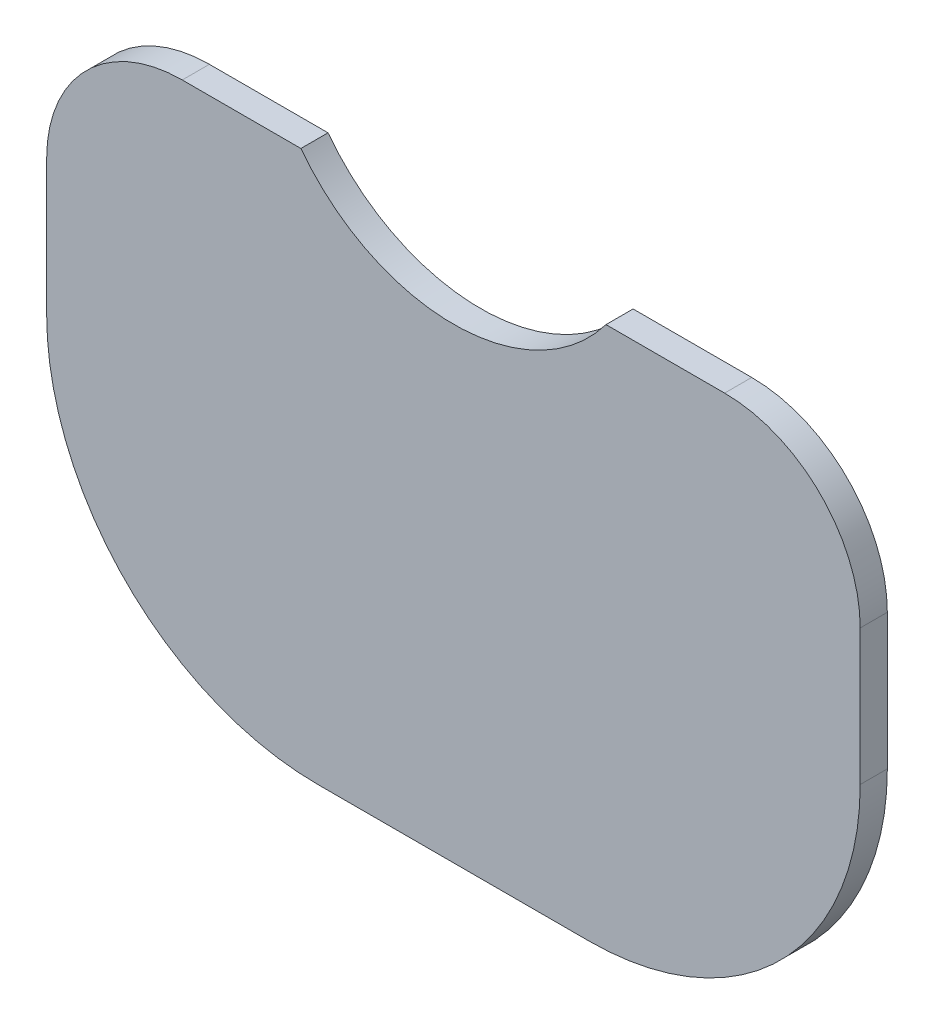
ISO-10303-21;
HEADER;
FILE_DESCRIPTION(('STEP AP214'),'2;1');
FILE_NAME('part.step','',(''),(''),'','','');
FILE_SCHEMA(('AUTOMOTIVE_DESIGN { 1 0 10303 214 1 1 1 1 }'));
ENDSEC;
DATA;
#1=APPLICATION_CONTEXT('core data for automotive mechanical design processes');
#2=APPLICATION_PROTOCOL_DEFINITION('international standard','automotive_design',2000,#1);
#3=PRODUCT_CONTEXT('',#1,'mechanical');
#4=PRODUCT('Part','Part','',(#3));
#5=PRODUCT_RELATED_PRODUCT_CATEGORY('part','',(#4));
#6=PRODUCT_DEFINITION_FORMATION('','',#4);
#7=PRODUCT_DEFINITION_CONTEXT('part definition',#1,'design');
#8=PRODUCT_DEFINITION('design','',#6,#7);
#9=PRODUCT_DEFINITION_SHAPE('','',#8);
#10=(LENGTH_UNIT() NAMED_UNIT(*) SI_UNIT(.MILLI.,.METRE.));
#11=(NAMED_UNIT(*) PLANE_ANGLE_UNIT() SI_UNIT($,.RADIAN.));
#12=(NAMED_UNIT(*) SI_UNIT($,.STERADIAN.) SOLID_ANGLE_UNIT());
#13=UNCERTAINTY_MEASURE_WITH_UNIT(LENGTH_MEASURE(1.E-05),#10,'distance_accuracy_value','');
#14=(GEOMETRIC_REPRESENTATION_CONTEXT(3) GLOBAL_UNCERTAINTY_ASSIGNED_CONTEXT((#13)) GLOBAL_UNIT_ASSIGNED_CONTEXT((#10,
#11,#12)) REPRESENTATION_CONTEXT('',''));
#15=CARTESIAN_POINT('',(0.,0.,0.));
#16=DIRECTION('',(0.,0.,1.));
#17=DIRECTION('',(1.,0.,0.));
#18=AXIS2_PLACEMENT_3D('',#15,#16,#17);
#19=CARTESIAN_POINT('',(-10.,0.,2.));
#20=DIRECTION('',(0.,0.,-1.));
#21=DIRECTION('',(-1.,0.,0.));
#22=AXIS2_PLACEMENT_3D('',#19,#20,#21);
#23=CYLINDRICAL_SURFACE('',#22,20.);
#24=CARTESIAN_POINT('',(-10.,0.,0.));
#25=DIRECTION('',(0.,0.,1.));
#26=DIRECTION('',(1.,0.,0.));
#27=AXIS2_PLACEMENT_3D('',#24,#25,#26);
#28=CIRCLE('',#27,20.);
#29=CARTESIAN_POINT('',(-9.99999999999986,-20.,0.));
#30=VERTEX_POINT('',#29);
#31=CARTESIAN_POINT('',(-30.,1.35308431126191E-13,0.));
#32=VERTEX_POINT('',#31);
#33=EDGE_CURVE('E155',#30,#32,#28,.F.);
#34=ORIENTED_EDGE('',*,*,#33,.F.);
#35=DIRECTION('',(0.,0.,-1.));
#36=VECTOR('',#35,1.);
#37=CARTESIAN_POINT('',(-9.99999999999986,-20.,2.));
#38=LINE('',#37,#36);
#39=CARTESIAN_POINT('',(-9.99999999999986,-20.,2.));
#40=VERTEX_POINT('',#39);
#41=EDGE_CURVE('E11',#40,#30,#38,.T.);
#42=ORIENTED_EDGE('',*,*,#41,.F.);
#43=CARTESIAN_POINT('',(-10.,0.,2.));
#44=DIRECTION('',(0.,0.,1.));
#45=DIRECTION('',(1.,0.,0.));
#46=AXIS2_PLACEMENT_3D('',#43,#44,#45);
#47=CIRCLE('',#46,20.);
#48=CARTESIAN_POINT('',(-30.,1.35308431126191E-13,2.));
#49=VERTEX_POINT('',#48);
#50=EDGE_CURVE('E188',#40,#49,#47,.F.);
#51=ORIENTED_EDGE('',*,*,#50,.T.);
#52=DIRECTION('',(0.,0.,-1.));
#53=VECTOR('',#52,1.);
#54=CARTESIAN_POINT('',(-30.,1.35308431126191E-13,2.));
#55=LINE('',#54,#53);
#56=EDGE_CURVE('E62',#49,#32,#55,.T.);
#57=ORIENTED_EDGE('',*,*,#56,.T.);
#58=EDGE_LOOP('',(#34,#42,#51,#57));
#59=FACE_BOUND('',#58,.T.);
#60=ADVANCED_FACE('F45',(#59),#23,.T.);
#61=CARTESIAN_POINT('',(0.,-20.,2.));
#62=DIRECTION('',(0.,-1.,0.));
#63=DIRECTION('',(1.,0.,0.));
#64=AXIS2_PLACEMENT_3D('',#61,#62,#63);
#65=PLANE('',#64);
#66=DIRECTION('',(-1.,0.,0.));
#67=VECTOR('',#66,1.);
#68=CARTESIAN_POINT('',(0.,-20.,0.));
#69=LINE('',#68,#67);
#70=CARTESIAN_POINT('',(9.99999999999986,-20.,0.));
#71=VERTEX_POINT('',#70);
#72=EDGE_CURVE('E158',#71,#30,#69,.T.);
#73=ORIENTED_EDGE('',*,*,#72,.F.);
#74=DIRECTION('',(0.,0.,-1.));
#75=VECTOR('',#74,1.);
#76=CARTESIAN_POINT('',(9.99999999999986,-20.,2.));
#77=LINE('',#76,#75);
#78=CARTESIAN_POINT('',(9.99999999999986,-20.,2.));
#79=VERTEX_POINT('',#78);
#80=EDGE_CURVE('E54',#79,#71,#77,.T.);
#81=ORIENTED_EDGE('',*,*,#80,.F.);
#82=DIRECTION('',(-1.,0.,0.));
#83=VECTOR('',#82,1.);
#84=CARTESIAN_POINT('',(0.,-20.,2.));
#85=LINE('',#84,#83);
#86=EDGE_CURVE('E244',#79,#40,#85,.T.);
#87=ORIENTED_EDGE('',*,*,#86,.T.);
#88=ORIENTED_EDGE('',*,*,#41,.T.);
#89=EDGE_LOOP('',(#73,#81,#87,#88));
#90=FACE_BOUND('',#89,.T.);
#91=ADVANCED_FACE('F219',(#90),#65,.T.);
#92=CARTESIAN_POINT('',(10.,0.,2.));
#93=DIRECTION('',(0.,0.,-1.));
#94=DIRECTION('',(-1.,0.,0.));
#95=AXIS2_PLACEMENT_3D('',#92,#93,#94);
#96=CYLINDRICAL_SURFACE('',#95,20.);
#97=CARTESIAN_POINT('',(10.,0.,0.));
#98=DIRECTION('',(0.,0.,1.));
#99=DIRECTION('',(1.,0.,0.));
#100=AXIS2_PLACEMENT_3D('',#97,#98,#99);
#101=CIRCLE('',#100,20.);
#102=CARTESIAN_POINT('',(30.,1.38777878078145E-13,0.));
#103=VERTEX_POINT('',#102);
#104=EDGE_CURVE('E163',#103,#71,#101,.F.);
#105=ORIENTED_EDGE('',*,*,#104,.F.);
#106=DIRECTION('',(0.,0.,-1.));
#107=VECTOR('',#106,1.);
#108=CARTESIAN_POINT('',(30.,1.38777878078145E-13,2.));
#109=LINE('',#108,#107);
#110=CARTESIAN_POINT('',(30.,1.38777878078145E-13,2.));
#111=VERTEX_POINT('',#110);
#112=EDGE_CURVE('E206',#111,#103,#109,.T.);
#113=ORIENTED_EDGE('',*,*,#112,.F.);
#114=CARTESIAN_POINT('',(10.,0.,2.));
#115=DIRECTION('',(0.,0.,1.));
#116=DIRECTION('',(1.,0.,0.));
#117=AXIS2_PLACEMENT_3D('',#114,#115,#116);
#118=CIRCLE('',#117,20.);
#119=EDGE_CURVE('E215',#111,#79,#118,.F.);
#120=ORIENTED_EDGE('',*,*,#119,.T.);
#121=ORIENTED_EDGE('',*,*,#80,.T.);
#122=EDGE_LOOP('',(#105,#113,#120,#121));
#123=FACE_BOUND('',#122,.T.);
#124=ADVANCED_FACE('F213',(#123),#96,.T.);
#125=CARTESIAN_POINT('',(30.,0.,2.));
#126=DIRECTION('',(-1.,0.,0.));
#127=DIRECTION('',(0.,0.,1.));
#128=AXIS2_PLACEMENT_3D('',#125,#126,#127);
#129=PLANE('',#128);
#130=DIRECTION('',(0.,1.,0.));
#131=VECTOR('',#130,1.);
#132=CARTESIAN_POINT('',(30.,0.,0.));
#133=LINE('',#132,#131);
#134=CARTESIAN_POINT('',(30.,9.99999999999993,0.));
#135=VERTEX_POINT('',#134);
#136=EDGE_CURVE('E167',#103,#135,#133,.T.);
#137=ORIENTED_EDGE('',*,*,#136,.T.);
#138=DIRECTION('',(0.,0.,-1.));
#139=VECTOR('',#138,1.);
#140=CARTESIAN_POINT('',(30.,9.99999999999993,2.));
#141=LINE('',#140,#139);
#142=CARTESIAN_POINT('',(30.,9.99999999999993,2.));
#143=VERTEX_POINT('',#142);
#144=EDGE_CURVE('E202',#143,#135,#141,.T.);
#145=ORIENTED_EDGE('',*,*,#144,.F.);
#146=DIRECTION('',(0.,1.,0.));
#147=VECTOR('',#146,1.);
#148=CARTESIAN_POINT('',(30.,0.,2.));
#149=LINE('',#148,#147);
#150=EDGE_CURVE('E236',#111,#143,#149,.T.);
#151=ORIENTED_EDGE('',*,*,#150,.F.);
#152=ORIENTED_EDGE('',*,*,#112,.T.);
#153=EDGE_LOOP('',(#137,#145,#151,#152));
#154=FACE_BOUND('',#153,.T.);
#155=ADVANCED_FACE('F227',(#154),#129,.F.);
#156=CARTESIAN_POINT('',(20.,10.,2.));
#157=DIRECTION('',(0.,0.,-1.));
#158=DIRECTION('',(-1.,0.,0.));
#159=AXIS2_PLACEMENT_3D('',#156,#157,#158);
#160=CYLINDRICAL_SURFACE('',#159,10.);
#161=CARTESIAN_POINT('',(20.,10.,0.));
#162=DIRECTION('',(0.,0.,1.));
#163=DIRECTION('',(1.,0.,0.));
#164=AXIS2_PLACEMENT_3D('',#161,#162,#163);
#165=CIRCLE('',#164,10.);
#166=CARTESIAN_POINT('',(19.9999999999999,20.,0.));
#167=VERTEX_POINT('',#166);
#168=EDGE_CURVE('E170',#135,#167,#165,.T.);
#169=ORIENTED_EDGE('',*,*,#168,.T.);
#170=DIRECTION('',(0.,0.,-1.));
#171=VECTOR('',#170,1.);
#172=CARTESIAN_POINT('',(19.9999999999999,20.,2.));
#173=LINE('',#172,#171);
#174=CARTESIAN_POINT('',(19.9999999999999,20.,2.));
#175=VERTEX_POINT('',#174);
#176=EDGE_CURVE('E198',#175,#167,#173,.T.);
#177=ORIENTED_EDGE('',*,*,#176,.F.);
#178=CARTESIAN_POINT('',(20.,10.,2.));
#179=DIRECTION('',(0.,0.,1.));
#180=DIRECTION('',(1.,0.,0.));
#181=AXIS2_PLACEMENT_3D('',#178,#179,#180);
#182=CIRCLE('',#181,10.);
#183=EDGE_CURVE('E233',#143,#175,#182,.T.);
#184=ORIENTED_EDGE('',*,*,#183,.F.);
#185=ORIENTED_EDGE('',*,*,#144,.T.);
#186=EDGE_LOOP('',(#169,#177,#184,#185));
#187=FACE_BOUND('',#186,.T.);
#188=ADVANCED_FACE('F231',(#187),#160,.T.);
#189=CARTESIAN_POINT('',(0.,20.,2.));
#190=DIRECTION('',(0.,-1.,0.));
#191=DIRECTION('',(1.,0.,0.));
#192=AXIS2_PLACEMENT_3D('',#189,#190,#191);
#193=PLANE('',#192);
#194=DIRECTION('',(-1.,0.,0.));
#195=VECTOR('',#194,1.);
#196=CARTESIAN_POINT('',(0.,20.,0.));
#197=LINE('',#196,#195);
#198=CARTESIAN_POINT('',(11.2498888883402,20.,0.));
#199=VERTEX_POINT('',#198);
#200=EDGE_CURVE('E173',#167,#199,#197,.T.);
#201=ORIENTED_EDGE('',*,*,#200,.T.);
#202=DIRECTION('',(0.,0.,-1.));
#203=VECTOR('',#202,1.);
#204=CARTESIAN_POINT('',(11.2498888883402,20.,2.));
#205=LINE('',#204,#203);
#206=CARTESIAN_POINT('',(11.2498888883402,20.,2.));
#207=VERTEX_POINT('',#206);
#208=EDGE_CURVE('E195',#207,#199,#205,.T.);
#209=ORIENTED_EDGE('',*,*,#208,.F.);
#210=DIRECTION('',(-1.,0.,0.));
#211=VECTOR('',#210,1.);
#212=CARTESIAN_POINT('',(0.,20.,2.));
#213=LINE('',#212,#211);
#214=EDGE_CURVE('E136',#175,#207,#213,.T.);
#215=ORIENTED_EDGE('',*,*,#214,.F.);
#216=ORIENTED_EDGE('',*,*,#176,.T.);
#217=EDGE_LOOP('',(#201,#209,#215,#216));
#218=FACE_BOUND('',#217,.T.);
#219=ADVANCED_FACE('F300',(#218),#193,.F.);
#220=CARTESIAN_POINT('',(0.,28.5,2.));
#221=DIRECTION('',(0.,0.,-1.));
#222=DIRECTION('',(-1.,0.,0.));
#223=AXIS2_PLACEMENT_3D('',#220,#221,#222);
#224=CYLINDRICAL_SURFACE('',#223,14.1);
#225=CARTESIAN_POINT('',(0.,28.5,0.));
#226=DIRECTION('',(0.,0.,1.));
#227=DIRECTION('',(1.,0.,0.));
#228=AXIS2_PLACEMENT_3D('',#225,#226,#227);
#229=CIRCLE('',#228,14.1);
#230=CARTESIAN_POINT('',(-11.2498888883402,20.,0.));
#231=VERTEX_POINT('',#230);
#232=EDGE_CURVE('E177',#231,#199,#229,.T.);
#233=ORIENTED_EDGE('',*,*,#232,.F.);
#234=DIRECTION('',(0.,0.,-1.));
#235=VECTOR('',#234,1.);
#236=CARTESIAN_POINT('',(-11.2498888883402,20.,2.));
#237=LINE('',#236,#235);
#238=CARTESIAN_POINT('',(-11.2498888883402,20.,2.));
#239=VERTEX_POINT('',#238);
#240=EDGE_CURVE('E145',#239,#231,#237,.T.);
#241=ORIENTED_EDGE('',*,*,#240,.F.);
#242=CARTESIAN_POINT('',(0.,28.5,2.));
#243=DIRECTION('',(0.,0.,1.));
#244=DIRECTION('',(1.,0.,0.));
#245=AXIS2_PLACEMENT_3D('',#242,#243,#244);
#246=CIRCLE('',#245,14.1);
#247=EDGE_CURVE('E132',#239,#207,#246,.T.);
#248=ORIENTED_EDGE('',*,*,#247,.T.);
#249=ORIENTED_EDGE('',*,*,#208,.T.);
#250=EDGE_LOOP('',(#233,#241,#248,#249));
#251=FACE_BOUND('',#250,.T.);
#252=ADVANCED_FACE('F299',(#251),#224,.F.);
#253=CARTESIAN_POINT('',(-19.9999999999999,20.,0.));
#254=VERTEX_POINT('',#253);
#255=EDGE_CURVE('E141',#231,#254,#197,.T.);
#256=ORIENTED_EDGE('',*,*,#255,.T.);
#257=DIRECTION('',(0.,0.,-1.));
#258=VECTOR('',#257,1.);
#259=CARTESIAN_POINT('',(-19.9999999999999,20.,2.));
#260=LINE('',#259,#258);
#261=CARTESIAN_POINT('',(-19.9999999999999,20.,2.));
#262=VERTEX_POINT('',#261);
#263=EDGE_CURVE('E138',#262,#254,#260,.T.);
#264=ORIENTED_EDGE('',*,*,#263,.F.);
#265=EDGE_CURVE('E125',#239,#262,#213,.T.);
#266=ORIENTED_EDGE('',*,*,#265,.F.);
#267=ORIENTED_EDGE('',*,*,#240,.T.);
#268=EDGE_LOOP('',(#256,#264,#266,#267));
#269=FACE_BOUND('',#268,.T.);
#270=ADVANCED_FACE('F139',(#269),#193,.F.);
#271=CARTESIAN_POINT('',(-20.,9.99999999999999,2.));
#272=DIRECTION('',(0.,0.,-1.));
#273=DIRECTION('',(-1.,0.,0.));
#274=AXIS2_PLACEMENT_3D('',#271,#272,#273);
#275=CYLINDRICAL_SURFACE('',#274,10.);
#276=CARTESIAN_POINT('',(-20.,9.99999999999999,0.));
#277=DIRECTION('',(0.,0.,1.));
#278=DIRECTION('',(1.,0.,0.));
#279=AXIS2_PLACEMENT_3D('',#276,#277,#278);
#280=CIRCLE('',#279,10.);
#281=CARTESIAN_POINT('',(-30.,9.99999999999992,0.));
#282=VERTEX_POINT('',#281);
#283=EDGE_CURVE('E181',#282,#254,#280,.F.);
#284=ORIENTED_EDGE('',*,*,#283,.F.);
#285=DIRECTION('',(0.,0.,-1.));
#286=VECTOR('',#285,1.);
#287=CARTESIAN_POINT('',(-30.,9.99999999999992,2.));
#288=LINE('',#287,#286);
#289=CARTESIAN_POINT('',(-30.,9.99999999999992,2.));
#290=VERTEX_POINT('',#289);
#291=EDGE_CURVE('E93',#290,#282,#288,.T.);
#292=ORIENTED_EDGE('',*,*,#291,.F.);
#293=CARTESIAN_POINT('',(-20.,9.99999999999999,2.));
#294=DIRECTION('',(0.,0.,1.));
#295=DIRECTION('',(1.,0.,0.));
#296=AXIS2_PLACEMENT_3D('',#293,#294,#295);
#297=CIRCLE('',#296,10.);
#298=EDGE_CURVE('E130',#290,#262,#297,.F.);
#299=ORIENTED_EDGE('',*,*,#298,.T.);
#300=ORIENTED_EDGE('',*,*,#263,.T.);
#301=EDGE_LOOP('',(#284,#292,#299,#300));
#302=FACE_BOUND('',#301,.T.);
#303=ADVANCED_FACE('F147',(#302),#275,.T.);
#304=CARTESIAN_POINT('',(-30.,0.,2.));
#305=DIRECTION('',(-1.,0.,0.));
#306=DIRECTION('',(0.,0.,1.));
#307=AXIS2_PLACEMENT_3D('',#304,#305,#306);
#308=PLANE('',#307);
#309=DIRECTION('',(0.,1.,0.));
#310=VECTOR('',#309,1.);
#311=CARTESIAN_POINT('',(-30.,0.,0.));
#312=LINE('',#311,#310);
#313=EDGE_CURVE('E184',#32,#282,#312,.T.);
#314=ORIENTED_EDGE('',*,*,#313,.F.);
#315=ORIENTED_EDGE('',*,*,#56,.F.);
#316=DIRECTION('',(0.,1.,0.));
#317=VECTOR('',#316,1.);
#318=CARTESIAN_POINT('',(-30.,0.,2.));
#319=LINE('',#318,#317);
#320=EDGE_CURVE('E149',#49,#290,#319,.T.);
#321=ORIENTED_EDGE('',*,*,#320,.T.);
#322=ORIENTED_EDGE('',*,*,#291,.T.);
#323=EDGE_LOOP('',(#314,#315,#321,#322));
#324=FACE_BOUND('',#323,.T.);
#325=ADVANCED_FACE('F286',(#324),#308,.T.);
#326=CARTESIAN_POINT('',(0.,0.,2.));
#327=DIRECTION('',(0.,0.,1.));
#328=DIRECTION('',(1.,0.,0.));
#329=AXIS2_PLACEMENT_3D('',#326,#327,#328);
#330=PLANE('',#329);
#331=ORIENTED_EDGE('',*,*,#50,.F.);
#332=ORIENTED_EDGE('',*,*,#86,.F.);
#333=ORIENTED_EDGE('',*,*,#119,.F.);
#334=ORIENTED_EDGE('',*,*,#150,.T.);
#335=ORIENTED_EDGE('',*,*,#183,.T.);
#336=ORIENTED_EDGE('',*,*,#214,.T.);
#337=ORIENTED_EDGE('',*,*,#247,.F.);
#338=ORIENTED_EDGE('',*,*,#265,.T.);
#339=ORIENTED_EDGE('',*,*,#298,.F.);
#340=ORIENTED_EDGE('',*,*,#320,.F.);
#341=EDGE_LOOP('',(#331,#332,#333,#334,#335,#336,#337,#338,#339,#340));
#342=FACE_BOUND('',#341,.T.);
#343=ADVANCED_FACE('F127',(#342),#330,.T.);
#344=CARTESIAN_POINT('',(0.,0.,0.));
#345=DIRECTION('',(0.,0.,1.));
#346=DIRECTION('',(1.,0.,0.));
#347=AXIS2_PLACEMENT_3D('',#344,#345,#346);
#348=PLANE('',#347);
#349=CARTESIAN_POINT('',(12.5,0.,0.));
#350=DIRECTION('',(0.,0.,1.));
#351=DIRECTION('',(1.,0.,0.));
#352=AXIS2_PLACEMENT_3D('',#349,#350,#351);
#353=CIRCLE('',#352,7.5);
#354=CARTESIAN_POINT('',(20.,0.,0.));
#355=VERTEX_POINT('',#354);
#356=EDGE_CURVE('E253',#355,#355,#353,.T.);
#357=ORIENTED_EDGE('',*,*,#356,.T.);
#358=EDGE_LOOP('',(#357));
#359=FACE_BOUND('',#358,.T.);
#360=CARTESIAN_POINT('',(-12.5,0.,0.));
#361=DIRECTION('',(0.,0.,1.));
#362=DIRECTION('',(1.,0.,0.));
#363=AXIS2_PLACEMENT_3D('',#360,#361,#362);
#364=CIRCLE('',#363,7.5);
#365=CARTESIAN_POINT('',(-5.,0.,0.));
#366=VERTEX_POINT('',#365);
#367=EDGE_CURVE('E249',#366,#366,#364,.T.);
#368=ORIENTED_EDGE('',*,*,#367,.T.);
#369=EDGE_LOOP('',(#368));
#370=FACE_BOUND('',#369,.T.);
#371=ORIENTED_EDGE('',*,*,#33,.T.);
#372=ORIENTED_EDGE('',*,*,#313,.T.);
#373=ORIENTED_EDGE('',*,*,#283,.T.);
#374=ORIENTED_EDGE('',*,*,#255,.F.);
#375=ORIENTED_EDGE('',*,*,#232,.T.);
#376=ORIENTED_EDGE('',*,*,#200,.F.);
#377=ORIENTED_EDGE('',*,*,#168,.F.);
#378=ORIENTED_EDGE('',*,*,#136,.F.);
#379=ORIENTED_EDGE('',*,*,#104,.T.);
#380=ORIENTED_EDGE('',*,*,#72,.T.);
#381=EDGE_LOOP('',(#371,#372,#373,#374,#375,#376,#377,#378,#379,#380));
#382=FACE_BOUND('',#381,.T.);
#383=ADVANCED_FACE('F222',(#359,#370,#382),#348,.F.);
#384=CARTESIAN_POINT('',(-12.5,0.,-6.5));
#385=DIRECTION('',(0.,0.,1.));
#386=DIRECTION('',(1.,0.,0.));
#387=AXIS2_PLACEMENT_3D('',#384,#385,#386);
#388=CYLINDRICAL_SURFACE('',#387,7.5);
#389=CARTESIAN_POINT('',(-12.5,0.,-6.5));
#390=DIRECTION('',(0.,0.,1.));
#391=DIRECTION('',(1.,0.,0.));
#392=AXIS2_PLACEMENT_3D('',#389,#390,#391);
#393=CIRCLE('',#392,7.5);
#394=CARTESIAN_POINT('',(-5.,0.,-6.5));
#395=VERTEX_POINT('',#394);
#396=EDGE_CURVE('E159',#395,#395,#393,.T.);
#397=CARTESIAN_POINT('',(-5.,0.,-6.5));
#398=CARTESIAN_POINT('',(-5.,0.,-6.43229166666667));
#399=CARTESIAN_POINT('',(-5.,0.,-6.36458333333333));
#400=CARTESIAN_POINT('',(-5.,0.,-6.22916666666667));
#401=CARTESIAN_POINT('',(-5.,0.,-6.16145833333333));
#402=CARTESIAN_POINT('',(-5.,0.,-6.02604166666667));
#403=CARTESIAN_POINT('',(-5.,0.,-5.95833333333333));
#404=CARTESIAN_POINT('',(-5.,0.,-5.82291666666667));
#405=CARTESIAN_POINT('',(-5.,0.,-5.75520833333333));
#406=CARTESIAN_POINT('',(-5.,0.,-5.61979166666667));
#407=CARTESIAN_POINT('',(-5.,0.,-5.55208333333333));
#408=CARTESIAN_POINT('',(-5.,0.,-5.41666666666667));
#409=CARTESIAN_POINT('',(-5.,0.,-5.34895833333333));
#410=CARTESIAN_POINT('',(-5.,0.,-5.21354166666667));
#411=CARTESIAN_POINT('',(-5.,0.,-5.14583333333333));
#412=CARTESIAN_POINT('',(-5.,0.,-5.01041666666667));
#413=CARTESIAN_POINT('',(-5.,0.,-4.94270833333333));
#414=CARTESIAN_POINT('',(-5.,0.,-4.80729166666667));
#415=CARTESIAN_POINT('',(-5.,0.,-4.73958333333333));
#416=CARTESIAN_POINT('',(-5.,0.,-4.60416666666667));
#417=CARTESIAN_POINT('',(-5.,0.,-4.53645833333333));
#418=CARTESIAN_POINT('',(-5.,0.,-4.40104166666667));
#419=CARTESIAN_POINT('',(-5.,0.,-4.33333333333333));
#420=CARTESIAN_POINT('',(-5.,0.,-4.19791666666667));
#421=CARTESIAN_POINT('',(-5.,0.,-4.13020833333333));
#422=CARTESIAN_POINT('',(-5.,0.,-3.99479166666667));
#423=CARTESIAN_POINT('',(-5.,0.,-3.92708333333333));
#424=CARTESIAN_POINT('',(-5.,0.,-3.79166666666667));
#425=CARTESIAN_POINT('',(-5.,0.,-3.72395833333333));
#426=CARTESIAN_POINT('',(-5.,0.,-3.58854166666667));
#427=CARTESIAN_POINT('',(-5.,0.,-3.52083333333333));
#428=CARTESIAN_POINT('',(-5.,0.,-3.38541666666667));
#429=CARTESIAN_POINT('',(-5.,0.,-3.31770833333333));
#430=CARTESIAN_POINT('',(-5.,0.,-3.18229166666667));
#431=CARTESIAN_POINT('',(-5.,0.,-3.11458333333333));
#432=CARTESIAN_POINT('',(-5.,0.,-2.97916666666667));
#433=CARTESIAN_POINT('',(-5.,0.,-2.91145833333333));
#434=CARTESIAN_POINT('',(-5.,0.,-2.77604166666667));
#435=CARTESIAN_POINT('',(-5.,0.,-2.70833333333333));
#436=CARTESIAN_POINT('',(-5.,0.,-2.57291666666667));
#437=CARTESIAN_POINT('',(-5.,0.,-2.50520833333333));
#438=CARTESIAN_POINT('',(-5.,0.,-2.36979166666667));
#439=CARTESIAN_POINT('',(-5.,0.,-2.30208333333333));
#440=CARTESIAN_POINT('',(-5.,0.,-2.16666666666667));
#441=CARTESIAN_POINT('',(-5.,0.,-2.09895833333333));
#442=CARTESIAN_POINT('',(-5.,0.,-1.96354166666667));
#443=CARTESIAN_POINT('',(-5.,0.,-1.89583333333333));
#444=CARTESIAN_POINT('',(-5.,0.,-1.76041666666667));
#445=CARTESIAN_POINT('',(-5.,0.,-1.69270833333333));
#446=CARTESIAN_POINT('',(-5.,0.,-1.55729166666667));
#447=CARTESIAN_POINT('',(-5.,0.,-1.48958333333333));
#448=CARTESIAN_POINT('',(-5.,0.,-1.35416666666667));
#449=CARTESIAN_POINT('',(-5.,0.,-1.28645833333333));
#450=CARTESIAN_POINT('',(-5.,0.,-1.15104166666667));
#451=CARTESIAN_POINT('',(-5.,0.,-1.08333333333333));
#452=CARTESIAN_POINT('',(-5.,0.,-0.947916666666667));
#453=CARTESIAN_POINT('',(-5.,0.,-0.880208333333333));
#454=CARTESIAN_POINT('',(-5.,0.,-0.744791666666667));
#455=CARTESIAN_POINT('',(-5.,0.,-0.677083333333333));
#456=CARTESIAN_POINT('',(-5.,0.,-0.541666666666667));
#457=CARTESIAN_POINT('',(-5.,0.,-0.473958333333333));
#458=CARTESIAN_POINT('',(-5.,0.,-0.338541666666667));
#459=CARTESIAN_POINT('',(-5.,0.,-0.270833333333334));
#460=CARTESIAN_POINT('',(-5.,0.,-0.135416666666667));
#461=CARTESIAN_POINT('',(-5.,0.,-0.0677083333333334));
#462=CARTESIAN_POINT('',(-5.,0.,0.));
#463=B_SPLINE_CURVE_WITH_KNOTS('',3,(#397,#398,#399,#400,#401,#402,#403,#404,#405,#406,#407,
#408,#409,#410,#411,#412,#413,#414,#415,#416,#417,#418,#419,#420,#421,#422,#423,#424,#425,#426,
#427,#428,#429,#430,#431,#432,#433,#434,#435,#436,#437,#438,#439,#440,#441,#442,#443,#444,#445,
#446,#447,#448,#449,#450,#451,#452,#453,#454,#455,#456,#457,#458,#459,#460,#461,#462),
.UNSPECIFIED.,.F.,.F.,(4,2,2,2,2,2,2,2,2,2,2,2,2,2,2,2,2,2,2,2,2,2,2,2,2,2,2,2,2,2,2,2,4),(0.,
0.203124999999999,0.40625,0.609375,0.8125,1.015625,1.21875,1.421875,1.625,1.828125,2.03125,
2.234375,2.4375,2.640625,2.84375,3.046875,3.25,3.453125,3.65625,3.859375,4.0625,4.265625,
4.46875,4.671875,4.875,5.078125,5.28125,5.484375,5.6875,5.890625,6.09375,6.296875,6.5),.UNSPECIFIED.);
#464=EDGE_CURVE('BSEAM279',#395,#366,#463,.T.);
#465=ORIENTED_EDGE('',*,*,#396,.T.);
#466=ORIENTED_EDGE('',*,*,#367,.F.);
#467=ORIENTED_EDGE('',*,*,#464,.T.);
#468=ORIENTED_EDGE('',*,*,#464,.F.);
#469=EDGE_LOOP('',(#465,#467,#466,#468));
#470=FACE_BOUND('',#469,.T.);
#471=ADVANCED_FACE('F279',(#470),#388,.T.);
#472=CARTESIAN_POINT('',(-12.5,0.,-6.5));
#473=DIRECTION('',(0.,0.,1.));
#474=DIRECTION('',(1.,0.,0.));
#475=AXIS2_PLACEMENT_3D('',#472,#473,#474);
#476=PLANE('',#475);
#477=ORIENTED_EDGE('',*,*,#396,.F.);
#478=EDGE_LOOP('',(#477));
#479=FACE_BOUND('',#478,.T.);
#480=ADVANCED_FACE('F270',(#479),#476,.F.);
#481=CARTESIAN_POINT('',(12.5,0.,-6.5));
#482=DIRECTION('',(0.,0.,1.));
#483=DIRECTION('',(1.,0.,0.));
#484=AXIS2_PLACEMENT_3D('',#481,#482,#483);
#485=CYLINDRICAL_SURFACE('',#484,7.5);
#486=CARTESIAN_POINT('',(12.5,0.,-6.5));
#487=DIRECTION('',(0.,0.,1.));
#488=DIRECTION('',(1.,0.,0.));
#489=AXIS2_PLACEMENT_3D('',#486,#487,#488);
#490=CIRCLE('',#489,7.5);
#491=CARTESIAN_POINT('',(20.,0.,-6.5));
#492=VERTEX_POINT('',#491);
#493=EDGE_CURVE('E257',#492,#492,#490,.T.);
#494=CARTESIAN_POINT('',(20.,0.,-6.5));
#495=CARTESIAN_POINT('',(20.,0.,-6.43229166666667));
#496=CARTESIAN_POINT('',(20.,0.,-6.36458333333333));
#497=CARTESIAN_POINT('',(20.,0.,-6.22916666666667));
#498=CARTESIAN_POINT('',(20.,0.,-6.16145833333333));
#499=CARTESIAN_POINT('',(20.,0.,-6.02604166666667));
#500=CARTESIAN_POINT('',(20.,0.,-5.95833333333333));
#501=CARTESIAN_POINT('',(20.,0.,-5.82291666666667));
#502=CARTESIAN_POINT('',(20.,0.,-5.75520833333333));
#503=CARTESIAN_POINT('',(20.,0.,-5.61979166666667));
#504=CARTESIAN_POINT('',(20.,0.,-5.55208333333333));
#505=CARTESIAN_POINT('',(20.,0.,-5.41666666666667));
#506=CARTESIAN_POINT('',(20.,0.,-5.34895833333333));
#507=CARTESIAN_POINT('',(20.,0.,-5.21354166666667));
#508=CARTESIAN_POINT('',(20.,0.,-5.14583333333333));
#509=CARTESIAN_POINT('',(20.,0.,-5.01041666666667));
#510=CARTESIAN_POINT('',(20.,0.,-4.94270833333333));
#511=CARTESIAN_POINT('',(20.,0.,-4.80729166666667));
#512=CARTESIAN_POINT('',(20.,0.,-4.73958333333333));
#513=CARTESIAN_POINT('',(20.,0.,-4.60416666666667));
#514=CARTESIAN_POINT('',(20.,0.,-4.53645833333333));
#515=CARTESIAN_POINT('',(20.,0.,-4.40104166666667));
#516=CARTESIAN_POINT('',(20.,0.,-4.33333333333333));
#517=CARTESIAN_POINT('',(20.,0.,-4.19791666666667));
#518=CARTESIAN_POINT('',(20.,0.,-4.13020833333333));
#519=CARTESIAN_POINT('',(20.,0.,-3.99479166666667));
#520=CARTESIAN_POINT('',(20.,0.,-3.92708333333333));
#521=CARTESIAN_POINT('',(20.,0.,-3.79166666666667));
#522=CARTESIAN_POINT('',(20.,0.,-3.72395833333333));
#523=CARTESIAN_POINT('',(20.,0.,-3.58854166666667));
#524=CARTESIAN_POINT('',(20.,0.,-3.52083333333333));
#525=CARTESIAN_POINT('',(20.,0.,-3.38541666666667));
#526=CARTESIAN_POINT('',(20.,0.,-3.31770833333333));
#527=CARTESIAN_POINT('',(20.,0.,-3.18229166666667));
#528=CARTESIAN_POINT('',(20.,0.,-3.11458333333333));
#529=CARTESIAN_POINT('',(20.,0.,-2.97916666666667));
#530=CARTESIAN_POINT('',(20.,0.,-2.91145833333333));
#531=CARTESIAN_POINT('',(20.,0.,-2.77604166666667));
#532=CARTESIAN_POINT('',(20.,0.,-2.70833333333333));
#533=CARTESIAN_POINT('',(20.,0.,-2.57291666666667));
#534=CARTESIAN_POINT('',(20.,0.,-2.50520833333333));
#535=CARTESIAN_POINT('',(20.,0.,-2.36979166666667));
#536=CARTESIAN_POINT('',(20.,0.,-2.30208333333333));
#537=CARTESIAN_POINT('',(20.,0.,-2.16666666666667));
#538=CARTESIAN_POINT('',(20.,0.,-2.09895833333333));
#539=CARTESIAN_POINT('',(20.,0.,-1.96354166666667));
#540=CARTESIAN_POINT('',(20.,0.,-1.89583333333333));
#541=CARTESIAN_POINT('',(20.,0.,-1.76041666666667));
#542=CARTESIAN_POINT('',(20.,0.,-1.69270833333333));
#543=CARTESIAN_POINT('',(20.,0.,-1.55729166666667));
#544=CARTESIAN_POINT('',(20.,0.,-1.48958333333333));
#545=CARTESIAN_POINT('',(20.,0.,-1.35416666666667));
#546=CARTESIAN_POINT('',(20.,0.,-1.28645833333333));
#547=CARTESIAN_POINT('',(20.,0.,-1.15104166666667));
#548=CARTESIAN_POINT('',(20.,0.,-1.08333333333333));
#549=CARTESIAN_POINT('',(20.,0.,-0.947916666666667));
#550=CARTESIAN_POINT('',(20.,0.,-0.880208333333333));
#551=CARTESIAN_POINT('',(20.,0.,-0.744791666666667));
#552=CARTESIAN_POINT('',(20.,0.,-0.677083333333333));
#553=CARTESIAN_POINT('',(20.,0.,-0.541666666666667));
#554=CARTESIAN_POINT('',(20.,0.,-0.473958333333333));
#555=CARTESIAN_POINT('',(20.,0.,-0.338541666666667));
#556=CARTESIAN_POINT('',(20.,0.,-0.270833333333334));
#557=CARTESIAN_POINT('',(20.,0.,-0.135416666666667));
#558=CARTESIAN_POINT('',(20.,0.,-0.0677083333333334));
#559=CARTESIAN_POINT('',(20.,0.,0.));
#560=B_SPLINE_CURVE_WITH_KNOTS('',3,(#494,#495,#496,#497,#498,#499,#500,#501,#502,#503,#504,
#505,#506,#507,#508,#509,#510,#511,#512,#513,#514,#515,#516,#517,#518,#519,#520,#521,#522,#523,
#524,#525,#526,#527,#528,#529,#530,#531,#532,#533,#534,#535,#536,#537,#538,#539,#540,#541,#542,
#543,#544,#545,#546,#547,#548,#549,#550,#551,#552,#553,#554,#555,#556,#557,#558,#559),
.UNSPECIFIED.,.F.,.F.,(4,2,2,2,2,2,2,2,2,2,2,2,2,2,2,2,2,2,2,2,2,2,2,2,2,2,2,2,2,2,2,2,4),(0.,
0.203124999999999,0.40625,0.609375,0.8125,1.015625,1.21875,1.421875,1.625,1.828125,2.03125,
2.234375,2.4375,2.640625,2.84375,3.046875,3.25,3.453125,3.65625,3.859375,4.0625,4.265625,
4.46875,4.671875,4.875,5.078125,5.28125,5.484375,5.6875,5.890625,6.09375,6.296875,6.5),.UNSPECIFIED.);
#561=EDGE_CURVE('BSEAM267',#492,#355,#560,.T.);
#562=ORIENTED_EDGE('',*,*,#493,.T.);
#563=ORIENTED_EDGE('',*,*,#356,.F.);
#564=ORIENTED_EDGE('',*,*,#561,.T.);
#565=ORIENTED_EDGE('',*,*,#561,.F.);
#566=EDGE_LOOP('',(#562,#564,#563,#565));
#567=FACE_BOUND('',#566,.T.);
#568=ADVANCED_FACE('F267',(#567),#485,.T.);
#569=CARTESIAN_POINT('',(12.5,0.,-6.5));
#570=DIRECTION('',(0.,0.,1.));
#571=DIRECTION('',(1.,0.,0.));
#572=AXIS2_PLACEMENT_3D('',#569,#570,#571);
#573=PLANE('',#572);
#574=ORIENTED_EDGE('',*,*,#493,.F.);
#575=EDGE_LOOP('',(#574));
#576=FACE_BOUND('',#575,.T.);
#577=ADVANCED_FACE('F269',(#576),#573,.F.);
#578=CLOSED_SHELL('',(#60,#91,#124,#155,#188,#219,#252,#270,#303,#325,#343,#383,#471,#480,#568,#577));
#579=MANIFOLD_SOLID_BREP('B2',#578);
#580=ADVANCED_BREP_SHAPE_REPRESENTATION('',(#18,#579),#14);
#581=SHAPE_DEFINITION_REPRESENTATION(#9,#580);
ENDSEC;
END-ISO-10303-21;
